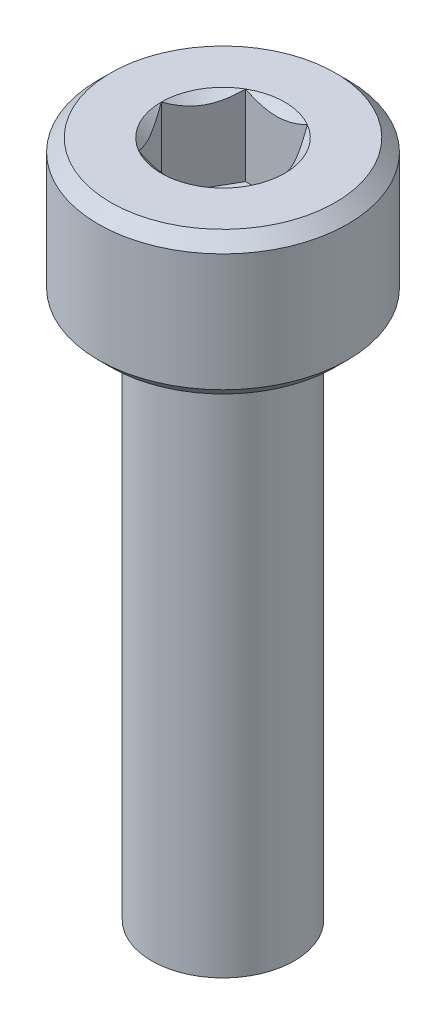
ISO-10303-21;
HEADER;
FILE_DESCRIPTION(('STEP AP214'),'2;1');
FILE_NAME('part.step','',(''),(''),'','','');
FILE_SCHEMA(('AUTOMOTIVE_DESIGN { 1 0 10303 214 1 1 1 1 }'));
ENDSEC;
DATA;
#1=APPLICATION_CONTEXT('core data for automotive mechanical design processes');
#2=APPLICATION_PROTOCOL_DEFINITION('international standard','automotive_design',2000,#1);
#3=PRODUCT_CONTEXT('',#1,'mechanical');
#4=PRODUCT('Part','Part','',(#3));
#5=PRODUCT_RELATED_PRODUCT_CATEGORY('part','',(#4));
#6=PRODUCT_DEFINITION_FORMATION('','',#4);
#7=PRODUCT_DEFINITION_CONTEXT('part definition',#1,'design');
#8=PRODUCT_DEFINITION('design','',#6,#7);
#9=PRODUCT_DEFINITION_SHAPE('','',#8);
#10=(LENGTH_UNIT() NAMED_UNIT(*) SI_UNIT(.MILLI.,.METRE.));
#11=(NAMED_UNIT(*) PLANE_ANGLE_UNIT() SI_UNIT($,.RADIAN.));
#12=(NAMED_UNIT(*) SI_UNIT($,.STERADIAN.) SOLID_ANGLE_UNIT());
#13=UNCERTAINTY_MEASURE_WITH_UNIT(LENGTH_MEASURE(1.E-05),#10,'distance_accuracy_value','');
#14=(GEOMETRIC_REPRESENTATION_CONTEXT(3) GLOBAL_UNCERTAINTY_ASSIGNED_CONTEXT((#13)) GLOBAL_UNIT_ASSIGNED_CONTEXT((#10,
#11,#12)) REPRESENTATION_CONTEXT('',''));
#15=CARTESIAN_POINT('',(0.,0.,0.));
#16=DIRECTION('',(0.,0.,1.));
#17=DIRECTION('',(1.,0.,0.));
#18=AXIS2_PLACEMENT_3D('',#15,#16,#17);
#19=CARTESIAN_POINT('',(0.,4.,0.));
#20=DIRECTION('',(0.,-1.,0.));
#21=DIRECTION('',(0.,0.,-1.));
#22=AXIS2_PLACEMENT_3D('',#19,#20,#21);
#23=CYLINDRICAL_SURFACE('',#22,3.5);
#24=CARTESIAN_POINT('',(0.,0.350000000000001,0.));
#25=DIRECTION('',(0.,1.,0.));
#26=DIRECTION('',(0.,0.,1.));
#27=AXIS2_PLACEMENT_3D('',#24,#25,#26);
#28=CIRCLE('',#27,3.5);
#29=CARTESIAN_POINT('',(0.,0.350000000000001,3.5));
#30=VERTEX_POINT('',#29);
#31=EDGE_CURVE('E229',#30,#30,#28,.T.);
#32=ORIENTED_EDGE('',*,*,#31,.T.);
#33=EDGE_LOOP('',(#32));
#34=FACE_BOUND('',#33,.T.);
#35=CARTESIAN_POINT('',(0.,3.65,0.));
#36=DIRECTION('',(0.,1.,0.));
#37=DIRECTION('',(0.,0.,1.));
#38=AXIS2_PLACEMENT_3D('',#35,#36,#37);
#39=CIRCLE('',#38,3.5);
#40=CARTESIAN_POINT('',(0.,3.65,3.5));
#41=VERTEX_POINT('',#40);
#42=EDGE_CURVE('E106',#41,#41,#39,.F.);
#43=ORIENTED_EDGE('',*,*,#42,.T.);
#44=EDGE_LOOP('',(#43));
#45=FACE_BOUND('',#44,.T.);
#46=ADVANCED_FACE('F34',(#34,#45),#23,.T.);
#47=CARTESIAN_POINT('',(0.,4.,0.));
#48=DIRECTION('',(0.,1.,0.));
#49=DIRECTION('',(0.,0.,1.));
#50=AXIS2_PLACEMENT_3D('',#47,#48,#49);
#51=PLANE('',#50);
#52=CARTESIAN_POINT('',(0.,4.,0.));
#53=DIRECTION('',(0.,1.,0.));
#54=DIRECTION('',(0.,0.,1.));
#55=AXIS2_PLACEMENT_3D('',#52,#53,#54);
#56=CIRCLE('',#55,3.15);
#57=CARTESIAN_POINT('',(0.,4.,3.15));
#58=VERTEX_POINT('',#57);
#59=EDGE_CURVE('E38',#58,#58,#56,.T.);
#60=ORIENTED_EDGE('',*,*,#59,.T.);
#61=EDGE_LOOP('',(#60));
#62=FACE_BOUND('',#61,.T.);
#63=CARTESIAN_POINT('',(0.,4.,0.));
#64=DIRECTION('',(0.,1.,0.));
#65=DIRECTION('',(0.,0.,1.));
#66=AXIS2_PLACEMENT_3D('',#63,#64,#65);
#67=CIRCLE('',#66,1.73205080756888);
#68=CARTESIAN_POINT('',(0.866025403784438,4.,1.5));
#69=VERTEX_POINT('',#68);
#70=CARTESIAN_POINT('',(1.73205080756888,4.,0.));
#71=VERTEX_POINT('',#70);
#72=EDGE_CURVE('E49',#69,#71,#67,.T.);
#73=ORIENTED_EDGE('',*,*,#72,.F.);
#74=CARTESIAN_POINT('',(-0.866025403784438,4.,1.5));
#75=VERTEX_POINT('',#74);
#76=EDGE_CURVE('E56',#75,#69,#67,.T.);
#77=ORIENTED_EDGE('',*,*,#76,.F.);
#78=CARTESIAN_POINT('',(-1.73205080756888,4.,0.));
#79=VERTEX_POINT('',#78);
#80=EDGE_CURVE('E129',#79,#75,#67,.T.);
#81=ORIENTED_EDGE('',*,*,#80,.F.);
#82=CARTESIAN_POINT('',(-0.866025403784439,4.,-1.5));
#83=VERTEX_POINT('',#82);
#84=EDGE_CURVE('E128',#83,#79,#67,.T.);
#85=ORIENTED_EDGE('',*,*,#84,.F.);
#86=CARTESIAN_POINT('',(0.866025403784438,4.,-1.5));
#87=VERTEX_POINT('',#86);
#88=EDGE_CURVE('E96',#87,#83,#67,.T.);
#89=ORIENTED_EDGE('',*,*,#88,.F.);
#90=EDGE_CURVE('E88',#71,#87,#67,.T.);
#91=ORIENTED_EDGE('',*,*,#90,.F.);
#92=EDGE_LOOP('',(#73,#77,#81,#85,#89,#91));
#93=FACE_BOUND('',#92,.T.);
#94=ADVANCED_FACE('F126',(#62,#93),#51,.T.);
#95=CARTESIAN_POINT('',(0.,0.,0.));
#96=DIRECTION('',(0.,1.,0.));
#97=DIRECTION('',(0.,0.,1.));
#98=AXIS2_PLACEMENT_3D('',#95,#96,#97);
#99=PLANE('',#98);
#100=CARTESIAN_POINT('',(0.,0.,0.));
#101=DIRECTION('',(0.,-1.,0.));
#102=DIRECTION('',(0.,0.,-1.));
#103=AXIS2_PLACEMENT_3D('',#100,#101,#102);
#104=CIRCLE('',#103,2.);
#105=CARTESIAN_POINT('',(0.,0.,-2.));
#106=VERTEX_POINT('',#105);
#107=EDGE_CURVE('E11',#106,#106,#104,.T.);
#108=ORIENTED_EDGE('',*,*,#107,.F.);
#109=EDGE_LOOP('',(#108));
#110=FACE_BOUND('',#109,.T.);
#111=CARTESIAN_POINT('',(0.,0.,0.));
#112=DIRECTION('',(0.,1.,0.));
#113=DIRECTION('',(0.,0.,1.));
#114=AXIS2_PLACEMENT_3D('',#111,#112,#113);
#115=CIRCLE('',#114,3.15);
#116=CARTESIAN_POINT('',(0.,0.,3.15));
#117=VERTEX_POINT('',#116);
#118=EDGE_CURVE('E227',#117,#117,#115,.F.);
#119=ORIENTED_EDGE('',*,*,#118,.T.);
#120=EDGE_LOOP('',(#119));
#121=FACE_BOUND('',#120,.T.);
#122=ADVANCED_FACE('F210',(#110,#121),#99,.F.);
#123=CARTESIAN_POINT('',(0.,4.,0.));
#124=DIRECTION('',(0.,1.,0.));
#125=DIRECTION('',(0.,0.,1.));
#126=AXIS2_PLACEMENT_3D('',#123,#124,#125);
#127=CONICAL_SURFACE('',#126,1.73205080756888,0.78539816339745);
#128=ORIENTED_EDGE('',*,*,#88,.T.);
#129=CARTESIAN_POINT('',(-1.72720812969692,4.55557851627079,-1.5));
#130=CARTESIAN_POINT('',(-1.68515175699268,4.52382990785743,-1.5));
#131=CARTESIAN_POINT('',(-1.64286104748673,4.49239259380738,-1.5));
#132=CARTESIAN_POINT('',(-1.55771581035942,4.43026908755641,-1.5));
#133=CARTESIAN_POINT('',(-1.51486114386668,4.3995830858922,-1.5));
#134=CARTESIAN_POINT('',(-1.3846813415127,4.30840719242716,-1.5));
#135=CARTESIAN_POINT('',(-1.29637976071654,4.24928834342677,-1.5));
#136=CARTESIAN_POINT('',(-1.11121478730467,4.1332309963165,-1.5));
#137=CARTESIAN_POINT('',(-1.01415038238167,4.07660955873301,-1.5));
#138=CARTESIAN_POINT('',(-0.815173408897606,3.97303688126565,-1.5));
#139=CARTESIAN_POINT('',(-0.713278669253285,3.92605304154167,-1.5));
#140=CARTESIAN_POINT('',(-0.560333774943112,3.86857266843083,-1.5));
#141=CARTESIAN_POINT('',(-0.511547982948042,3.85207538775725,-1.5));
#142=CARTESIAN_POINT('',(-0.412798620136866,3.822997512927,-1.5));
#143=CARTESIAN_POINT('',(-0.362834968437563,3.81041718859402,-1.5));
#144=CARTESIAN_POINT('',(-0.262863235444982,3.79003619414677,-1.5));
#145=CARTESIAN_POINT('',(-0.212872113808023,3.78215363274598,-1.5));
#146=CARTESIAN_POINT('',(-0.112355243569545,3.771322063969,-1.5));
#147=CARTESIAN_POINT('',(-0.0618295883726279,3.76837220852435,-1.5));
#148=CARTESIAN_POINT('',(0.037429173332384,3.76762485772485,-1.5));
#149=CARTESIAN_POINT('',(0.0861609672002989,3.76964473355808,-1.5));
#150=CARTESIAN_POINT('',(0.183206937768827,3.77832255289676,-1.5));
#151=CARTESIAN_POINT('',(0.231521073438269,3.78498094696846,-1.5));
#152=CARTESIAN_POINT('',(0.328199853425436,3.80268524412257,-1.5));
#153=CARTESIAN_POINT('',(0.376550616310328,3.81380581125704,-1.5));
#154=CARTESIAN_POINT('',(0.472195697125598,3.83984341404871,-1.5));
#155=CARTESIAN_POINT('',(0.51949010309274,3.85476013204094,-1.5));
#156=CARTESIAN_POINT('',(0.668391282696624,3.90733522359607,-1.5));
#157=CARTESIAN_POINT('',(0.767878709508552,3.95098128747198,-1.5));
#158=CARTESIAN_POINT('',(0.962179866690724,4.0480229945931,-1.5));
#159=CARTESIAN_POINT('',(1.05697519961444,4.10145366508953,-1.5));
#160=CARTESIAN_POINT('',(1.23814273533383,4.21168585200456,-1.5));
#161=CARTESIAN_POINT('',(1.3246994218129,4.2681879206986,-1.5));
#162=CARTESIAN_POINT('',(1.45222331290673,4.35553430157866,-1.5));
#163=CARTESIAN_POINT('',(1.49418091978756,4.38495775868004,-1.5));
#164=CARTESIAN_POINT('',(1.57752272931476,4.44458282183046,-1.5));
#165=CARTESIAN_POINT('',(1.61890708647354,4.47478421166444,-1.5));
#166=CARTESIAN_POINT('',(1.66005278019494,4.50530817860946,-1.5));
#167=B_SPLINE_CURVE_WITH_KNOTS('',3,(#129,#130,#131,#132,#133,#134,#135,#136,#137,#138,#139,
#140,#141,#142,#143,#144,#145,#146,#147,#148,#149,#150,#151,#152,#153,#154,#155,#156,#157,#158,
#159,#160,#161,#162,#163,#164,#165,#166),.UNSPECIFIED.,.F.,.F.,(4,2,2,2,2,2,2,2,2,2,2,2,2,2,2,2,
2,2,4),(0.,0.158079548982669,0.316198780993942,0.634850417346958,0.971690311361509,
1.30737131660667,1.46173961127089,1.61611853740677,1.76772101421409,1.91929742368538,
2.065387412096,2.21149159305544,2.36014984633872,2.50879566386709,2.83376031422673,
3.15991186985652,3.46985601802197,3.62358896039974,3.7772796264207),.UNSPECIFIED.);
#168=EDGE_CURVE('E101',#87,#83,#167,.F.);
#169=ORIENTED_EDGE('',*,*,#168,.F.);
#170=EDGE_LOOP('',(#128,#169));
#171=FACE_BOUND('',#170,.T.);
#172=ADVANCED_FACE('F102',(#171),#127,.F.);
#173=ORIENTED_EDGE('',*,*,#84,.T.);
#174=CARTESIAN_POINT('',(-0.865909933730601,4.00011548160007,-1.5002));
#175=CARTESIAN_POINT('',(-0.895682611594166,3.97036547606733,-1.44863220926292));
#176=CARTESIAN_POINT('',(-0.925953159489765,3.94236248391031,-1.3962020823348));
#177=CARTESIAN_POINT('',(-0.987678321317123,3.89108923044014,-1.2892909659444));
#178=CARTESIAN_POINT('',(-1.01913880822717,3.86784750504437,-1.23479980418534));
#179=CARTESIAN_POINT('',(-1.08257741237344,3.82803372899222,-1.12492091864275));
#180=CARTESIAN_POINT('',(-1.11453936608521,3.8113615856709,-1.0695611909048));
#181=CARTESIAN_POINT('',(-1.1791670593912,3.7856744568181,-0.957622742522849));
#182=CARTESIAN_POINT('',(-1.21183082354213,3.77664029047887,-0.901047443446992));
#183=CARTESIAN_POINT('',(-1.26812411040032,3.76848908122685,-0.803544610483559));
#184=CARTESIAN_POINT('',(-1.29168087824208,3.76728225298922,-0.762743091719534));
#185=CARTESIAN_POINT('',(-1.33875285845138,3.76931405716227,-0.681212030384142));
#186=CARTESIAN_POINT('',(-1.36226806050018,3.77255367074831,-0.64048250568537));
#187=CARTESIAN_POINT('',(-1.40907206156905,3.78329198598196,-0.559415597836584));
#188=CARTESIAN_POINT('',(-1.43236062923612,3.79079465301873,-0.519078615401712));
#189=CARTESIAN_POINT('',(-1.47854689118996,3.80965161192829,-0.439081663085969));
#190=CARTESIAN_POINT('',(-1.50144441326545,3.82100755701858,-0.399421991483792));
#191=CARTESIAN_POINT('',(-1.56009461325633,3.85472164759267,-0.297836865225515));
#192=CARTESIAN_POINT('',(-1.59548353987866,3.87962184909337,-0.236541446290311));
#193=CARTESIAN_POINT('',(-1.64751843074894,3.92165665327158,-0.146414371536686));
#194=CARTESIAN_POINT('',(-1.66466545167617,3.9364251535591,-0.116714860092282));
#195=CARTESIAN_POINT('',(-1.69864410935691,3.96731056594017,-0.0578620986162487));
#196=CARTESIAN_POINT('',(-1.71547589206761,3.98342683412171,-0.0287085957793624));
#197=CARTESIAN_POINT('',(-1.73216627762272,4.00011548160007,0.00020000000000028));
#198=B_SPLINE_CURVE_WITH_KNOTS('',3,(#174,#175,#176,#177,#178,#179,#180,#181,#182,#183,#184,
#185,#186,#187,#188,#189,#190,#191,#192,#193,#194,#195,#196,#197),.UNSPECIFIED.,.F.,.F.,(4,2,2,
2,2,2,2,2,2,2,2,4),(0.,0.199829143693304,0.400822987382388,0.598623720538181,0.795926240188889,
0.937113067959881,1.07833105577193,1.21968061668222,1.36109089931054,1.58570969637565,
1.69770705470964,1.80965120737194),.UNSPECIFIED.);
#199=EDGE_CURVE('E131',#83,#79,#198,.T.);
#200=ORIENTED_EDGE('',*,*,#199,.F.);
#201=EDGE_LOOP('',(#173,#200));
#202=FACE_BOUND('',#201,.T.);
#203=ADVANCED_FACE('F242',(#202),#127,.F.);
#204=ORIENTED_EDGE('',*,*,#80,.T.);
#205=CARTESIAN_POINT('',(-1.73216627762272,4.00011548160007,-0.000199999999999694));
#206=CARTESIAN_POINT('',(-1.70239359975915,3.97036547606733,0.051367790737076));
#207=CARTESIAN_POINT('',(-1.67212305186355,3.94236248391031,0.103797917665201));
#208=CARTESIAN_POINT('',(-1.61039789003619,3.89108923044014,0.210709034055597));
#209=CARTESIAN_POINT('',(-1.57893740312614,3.86784750504437,0.265200195814662));
#210=CARTESIAN_POINT('',(-1.51549879897987,3.82803372899222,0.375079081357249));
#211=CARTESIAN_POINT('',(-1.4835368452681,3.8113615856709,0.4304388090952));
#212=CARTESIAN_POINT('',(-1.41890915196211,3.7856744568181,0.542377257477151));
#213=CARTESIAN_POINT('',(-1.38624538781118,3.77664029047887,0.598952556553009));
#214=CARTESIAN_POINT('',(-1.32995210095299,3.76848908122685,0.696455389516441));
#215=CARTESIAN_POINT('',(-1.30639533311124,3.76728225298922,0.737256908280466));
#216=CARTESIAN_POINT('',(-1.25932335290193,3.76931405716227,0.818787969615858));
#217=CARTESIAN_POINT('',(-1.23580815085313,3.77255367074831,0.85951749431463));
#218=CARTESIAN_POINT('',(-1.18900414978427,3.78329198598196,0.940584402163416));
#219=CARTESIAN_POINT('',(-1.1657155821172,3.79079465301873,0.980921384598288));
#220=CARTESIAN_POINT('',(-1.11952932016335,3.80965161192829,1.06091833691403));
#221=CARTESIAN_POINT('',(-1.09663179808786,3.82100755701859,1.10057800851621));
#222=CARTESIAN_POINT('',(-1.03798159809698,3.85472164759267,1.20216313477448));
#223=CARTESIAN_POINT('',(-1.00259267147465,3.87962184909337,1.26345855370969));
#224=CARTESIAN_POINT('',(-0.950557780604375,3.92165665327158,1.35358562846331));
#225=CARTESIAN_POINT('',(-0.933410759677147,3.9364251535591,1.38328513990772));
#226=CARTESIAN_POINT('',(-0.899432101996407,3.96731056594017,1.44213790138375));
#227=CARTESIAN_POINT('',(-0.88260031928571,3.98342683412171,1.47129140422064));
#228=CARTESIAN_POINT('',(-0.865909933730601,4.00011548160007,1.5002));
#229=B_SPLINE_CURVE_WITH_KNOTS('',3,(#205,#206,#207,#208,#209,#210,#211,#212,#213,#214,#215,
#216,#217,#218,#219,#220,#221,#222,#223,#224,#225,#226,#227,#228),.UNSPECIFIED.,.F.,.F.,(4,2,2,
2,2,2,2,2,2,2,2,4),(0.,0.199829143693305,0.400822987382389,0.598623720538181,0.795926240188889,
0.937113067959881,1.07833105577193,1.21968061668222,1.36109089931054,1.58570969637565,
1.69770705470964,1.80965120737194),.UNSPECIFIED.);
#230=EDGE_CURVE('E141',#79,#75,#229,.T.);
#231=ORIENTED_EDGE('',*,*,#230,.F.);
#232=EDGE_LOOP('',(#204,#231));
#233=FACE_BOUND('',#232,.T.);
#234=ADVANCED_FACE('F258',(#233),#127,.F.);
#235=ORIENTED_EDGE('',*,*,#76,.T.);
#236=CARTESIAN_POINT('',(-1.72720812994822,4.55557851646053,1.5));
#237=CARTESIAN_POINT('',(-1.68515175723693,4.52382990803985,1.5));
#238=CARTESIAN_POINT('',(-1.64286104772391,4.49239259398251,1.5));
#239=CARTESIAN_POINT('',(-1.55771581058238,4.43026908771699,1.5));
#240=CARTESIAN_POINT('',(-1.51486114408249,4.39958308604553,1.5));
#241=CARTESIAN_POINT('',(-1.38468134170665,4.30840719255859,1.5));
#242=CARTESIAN_POINT('',(-1.29637976089561,4.24928834354366,1.5));
#243=CARTESIAN_POINT('',(-1.11121478745132,4.13323099640349,1.5));
#244=CARTESIAN_POINT('',(-1.01415038251067,4.07660955880473,1.5));
#245=CARTESIAN_POINT('',(-0.815173408989814,3.9730368813091,1.5));
#246=CARTESIAN_POINT('',(-0.71327866932636,3.92605304157206,1.5));
#247=CARTESIAN_POINT('',(-0.56033377500179,3.86857266845154,1.5));
#248=CARTESIAN_POINT('',(-0.511547983012749,3.85207538777834,1.5));
#249=CARTESIAN_POINT('',(-0.412798620213828,3.82299751294763,1.5));
#250=CARTESIAN_POINT('',(-0.362834968520751,3.8104171886138,1.5));
#251=CARTESIAN_POINT('',(-0.262863235540417,3.79003619416346,1.5));
#252=CARTESIAN_POINT('',(-0.212872113909475,3.78215363276045,1.5));
#253=CARTESIAN_POINT('',(-0.112355243682832,3.77132206397768,1.5));
#254=CARTESIAN_POINT('',(-0.061829588491731,3.76837220852945,1.5));
#255=CARTESIAN_POINT('',(0.0374291732025493,3.76762485772178,1.5));
#256=CARTESIAN_POINT('',(0.086160967065534,3.76964473355048,1.5));
#257=CARTESIAN_POINT('',(0.183206937624695,3.77832255287941,1.5));
#258=CARTESIAN_POINT('',(0.2315210732897,3.78498094694588,1.5));
#259=CARTESIAN_POINT('',(0.328199853268108,3.80268524408904,1.5));
#260=CARTESIAN_POINT('',(0.376550616148692,3.81380581121775,1.5));
#261=CARTESIAN_POINT('',(0.47219569695576,3.83984341399777,1.5));
#262=CARTESIAN_POINT('',(0.51949010291901,3.8547601319841,1.5));
#263=CARTESIAN_POINT('',(0.668391282485064,3.90733522351148,1.5));
#264=CARTESIAN_POINT('',(0.767878709264951,3.95098128736184,1.5));
#265=CARTESIAN_POINT('',(0.9621798663855,4.04802299442906,1.5));
#266=CARTESIAN_POINT('',(1.05697519927965,4.10145366489712,1.5));
#267=CARTESIAN_POINT('',(1.23814273494588,4.21168585175783,1.5));
#268=CARTESIAN_POINT('',(1.32469942140117,4.26818792042618,1.5));
#269=CARTESIAN_POINT('',(1.45222331245985,4.35553430126784,1.5));
#270=CARTESIAN_POINT('',(1.49418091932912,4.38495775835653,1.5));
#271=CARTESIAN_POINT('',(1.5775227288333,4.44458282148157,1.5));
#272=CARTESIAN_POINT('',(1.6189070859806,4.47478421130286,1.5));
#273=CARTESIAN_POINT('',(1.66005277969054,4.50530817823521,1.5));
#274=B_SPLINE_CURVE_WITH_KNOTS('',3,(#236,#237,#238,#239,#240,#241,#242,#243,#244,#245,#246,
#247,#248,#249,#250,#251,#252,#253,#254,#255,#256,#257,#258,#259,#260,#261,#262,#263,#264,#265,
#266,#267,#268,#269,#270,#271,#272,#273),.UNSPECIFIED.,.F.,.F.,(4,2,2,2,2,2,2,2,2,2,2,2,2,2,2,2,
2,2,4),(0.,0.158079549012757,0.316198781054129,0.634850417468465,0.971690311551782,
1.30737131686505,1.46173961151184,1.61611853763032,1.76772101442095,1.91929742387554,
2.06538741227089,2.21149159321503,2.36014984648185,2.50879566399376,2.83376031423511,
3.15991186974582,3.4698560178094,3.62358896013692,3.77727962610764),.UNSPECIFIED.);
#275=EDGE_CURVE('E170',#75,#69,#274,.T.);
#276=ORIENTED_EDGE('',*,*,#275,.F.);
#277=EDGE_LOOP('',(#235,#276));
#278=FACE_BOUND('',#277,.T.);
#279=ADVANCED_FACE('F288',(#278),#127,.F.);
#280=ORIENTED_EDGE('',*,*,#72,.T.);
#281=CARTESIAN_POINT('',(0.865909933730601,4.00011548160007,1.5002));
#282=CARTESIAN_POINT('',(0.895682611594166,3.97036547606733,1.44863220926292));
#283=CARTESIAN_POINT('',(0.925953159489765,3.94236248391031,1.3962020823348));
#284=CARTESIAN_POINT('',(0.987678321317124,3.89108923044014,1.2892909659444));
#285=CARTESIAN_POINT('',(1.01913880822717,3.86784750504437,1.23479980418534));
#286=CARTESIAN_POINT('',(1.08257741237344,3.82803372899222,1.12492091864275));
#287=CARTESIAN_POINT('',(1.11453936608521,3.8113615856709,1.0695611909048));
#288=CARTESIAN_POINT('',(1.1791670593912,3.7856744568181,0.95762274252285));
#289=CARTESIAN_POINT('',(1.21183082354213,3.77664029047887,0.901047443446992));
#290=CARTESIAN_POINT('',(1.26812411040032,3.76848908122685,0.80354461048356));
#291=CARTESIAN_POINT('',(1.29168087824208,3.76728225298922,0.762743091719534));
#292=CARTESIAN_POINT('',(1.33875285845138,3.76931405716227,0.681212030384142));
#293=CARTESIAN_POINT('',(1.36226806050018,3.77255367074831,0.640482505685371));
#294=CARTESIAN_POINT('',(1.40907206156905,3.78329198598196,0.559415597836584));
#295=CARTESIAN_POINT('',(1.43236062923612,3.79079465301873,0.519078615401712));
#296=CARTESIAN_POINT('',(1.47854689118996,3.80965161192829,0.43908166308597));
#297=CARTESIAN_POINT('',(1.50144441326545,3.82100755701859,0.399421991483792));
#298=CARTESIAN_POINT('',(1.56009461325633,3.85472164759267,0.297836865225515));
#299=CARTESIAN_POINT('',(1.59548353987866,3.87962184909337,0.236541446290311));
#300=CARTESIAN_POINT('',(1.64751843074894,3.92165665327158,0.146414371536686));
#301=CARTESIAN_POINT('',(1.66466545167617,3.9364251535591,0.116714860092282));
#302=CARTESIAN_POINT('',(1.69864410935691,3.96731056594017,0.0578620986162488));
#303=CARTESIAN_POINT('',(1.71547589206761,3.98342683412171,0.0287085957793626));
#304=CARTESIAN_POINT('',(1.73216627762272,4.00011548160007,-0.000200000000000026));
#305=B_SPLINE_CURVE_WITH_KNOTS('',3,(#281,#282,#283,#284,#285,#286,#287,#288,#289,#290,#291,
#292,#293,#294,#295,#296,#297,#298,#299,#300,#301,#302,#303,#304),.UNSPECIFIED.,.F.,.F.,(4,2,2,
2,2,2,2,2,2,2,2,4),(0.,0.199829143693305,0.400822987382389,0.59862372053818,0.795926240188889,
0.937113067959881,1.07833105577193,1.21968061668222,1.36109089931054,1.58570969637565,
1.69770705470964,1.80965120737194),.UNSPECIFIED.);
#306=EDGE_CURVE('E116',#69,#71,#305,.T.);
#307=ORIENTED_EDGE('',*,*,#306,.F.);
#308=EDGE_LOOP('',(#280,#307));
#309=FACE_BOUND('',#308,.T.);
#310=ADVANCED_FACE('F156',(#309),#127,.F.);
#311=ORIENTED_EDGE('',*,*,#90,.T.);
#312=CARTESIAN_POINT('',(1.73216627762272,4.00011548160007,0.000200000000000282));
#313=CARTESIAN_POINT('',(1.70239359975915,3.97036547606733,-0.0513677907370753));
#314=CARTESIAN_POINT('',(1.67212305186355,3.94236248391031,-0.103797917665201));
#315=CARTESIAN_POINT('',(1.61039789003619,3.89108923044014,-0.210709034055596));
#316=CARTESIAN_POINT('',(1.57893740312614,3.86784750504437,-0.265200195814661));
#317=CARTESIAN_POINT('',(1.51549879897987,3.82803372899222,-0.375079081357248));
#318=CARTESIAN_POINT('',(1.4835368452681,3.8113615856709,-0.430438809095199));
#319=CARTESIAN_POINT('',(1.41890915196211,3.7856744568181,-0.54237725747715));
#320=CARTESIAN_POINT('',(1.38624538781118,3.77664029047887,-0.598952556553008));
#321=CARTESIAN_POINT('',(1.32995210095299,3.76848908122685,-0.69645538951644));
#322=CARTESIAN_POINT('',(1.30639533311124,3.76728225298922,-0.737256908280466));
#323=CARTESIAN_POINT('',(1.25932335290193,3.76931405716227,-0.818787969615858));
#324=CARTESIAN_POINT('',(1.23580815085313,3.77255367074831,-0.85951749431463));
#325=CARTESIAN_POINT('',(1.18900414978427,3.78329198598196,-0.940584402163416));
#326=CARTESIAN_POINT('',(1.1657155821172,3.79079465301873,-0.980921384598288));
#327=CARTESIAN_POINT('',(1.11952932016335,3.80965161192829,-1.06091833691403));
#328=CARTESIAN_POINT('',(1.09663179808786,3.82100755701858,-1.10057800851621));
#329=CARTESIAN_POINT('',(1.03798159809698,3.85472164759267,-1.20216313477448));
#330=CARTESIAN_POINT('',(1.00259267147465,3.87962184909337,-1.26345855370969));
#331=CARTESIAN_POINT('',(0.950557780604375,3.92165665327158,-1.35358562846331));
#332=CARTESIAN_POINT('',(0.933410759677148,3.9364251535591,-1.38328513990772));
#333=CARTESIAN_POINT('',(0.899432101996407,3.96731056594017,-1.44213790138375));
#334=CARTESIAN_POINT('',(0.88260031928571,3.98342683412171,-1.47129140422064));
#335=CARTESIAN_POINT('',(0.865909933730601,4.00011548160007,-1.5002));
#336=B_SPLINE_CURVE_WITH_KNOTS('',3,(#312,#313,#314,#315,#316,#317,#318,#319,#320,#321,#322,
#323,#324,#325,#326,#327,#328,#329,#330,#331,#332,#333,#334,#335),.UNSPECIFIED.,.F.,.F.,(4,2,2,
2,2,2,2,2,2,2,2,4),(0.,0.199829143693305,0.400822987382389,0.598623720538181,0.79592624018889,
0.937113067959881,1.07833105577193,1.21968061668222,1.36109089931054,1.58570969637566,
1.69770705470964,1.80965120737194),.UNSPECIFIED.);
#337=EDGE_CURVE('E92',#71,#87,#336,.T.);
#338=ORIENTED_EDGE('',*,*,#337,.F.);
#339=EDGE_LOOP('',(#311,#338));
#340=FACE_BOUND('',#339,.T.);
#341=ADVANCED_FACE('F90',(#340),#127,.F.);
#342=CARTESIAN_POINT('',(0.,1.75,0.));
#343=DIRECTION('',(0.,1.,0.));
#344=DIRECTION('',(0.,0.,1.));
#345=AXIS2_PLACEMENT_3D('',#342,#343,#344);
#346=PLANE('',#345);
#347=DIRECTION('',(-0.5,0.,-0.866025403784439));
#348=VECTOR('',#347,1.);
#349=CARTESIAN_POINT('',(1.73205080756888,1.75,0.));
#350=LINE('',#349,#348);
#351=CARTESIAN_POINT('',(1.73205080756888,1.75,0.));
#352=VERTEX_POINT('',#351);
#353=CARTESIAN_POINT('',(0.866025403784438,1.75,-1.5));
#354=VERTEX_POINT('',#353);
#355=EDGE_CURVE('E115',#352,#354,#350,.T.);
#356=ORIENTED_EDGE('',*,*,#355,.T.);
#357=DIRECTION('',(-1.,0.,0.));
#358=VECTOR('',#357,1.);
#359=CARTESIAN_POINT('',(0.866025403784438,1.75,-1.5));
#360=LINE('',#359,#358);
#361=CARTESIAN_POINT('',(-0.866025403784439,1.75,-1.5));
#362=VERTEX_POINT('',#361);
#363=EDGE_CURVE('E120',#354,#362,#360,.T.);
#364=ORIENTED_EDGE('',*,*,#363,.T.);
#365=DIRECTION('',(-0.5,0.,0.866025403784439));
#366=VECTOR('',#365,1.);
#367=CARTESIAN_POINT('',(-0.866025403784439,1.75,-1.5));
#368=LINE('',#367,#366);
#369=CARTESIAN_POINT('',(-1.73205080756888,1.75,0.));
#370=VERTEX_POINT('',#369);
#371=EDGE_CURVE('E282',#362,#370,#368,.T.);
#372=ORIENTED_EDGE('',*,*,#371,.T.);
#373=DIRECTION('',(0.5,0.,0.866025403784439));
#374=VECTOR('',#373,1.);
#375=CARTESIAN_POINT('',(-1.73205080756888,1.75,0.));
#376=LINE('',#375,#374);
#377=CARTESIAN_POINT('',(-0.866025403784438,1.75,1.5));
#378=VERTEX_POINT('',#377);
#379=EDGE_CURVE('E265',#370,#378,#376,.T.);
#380=ORIENTED_EDGE('',*,*,#379,.T.);
#381=DIRECTION('',(1.,0.,0.));
#382=VECTOR('',#381,1.);
#383=CARTESIAN_POINT('',(-0.866025403784438,1.75,1.5));
#384=LINE('',#383,#382);
#385=CARTESIAN_POINT('',(0.866025403784439,1.75,1.5));
#386=VERTEX_POINT('',#385);
#387=EDGE_CURVE('E278',#378,#386,#384,.T.);
#388=ORIENTED_EDGE('',*,*,#387,.T.);
#389=DIRECTION('',(0.5,0.,-0.866025403784439));
#390=VECTOR('',#389,1.);
#391=CARTESIAN_POINT('',(0.866025403784439,1.75,1.5));
#392=LINE('',#391,#390);
#393=EDGE_CURVE('E123',#386,#352,#392,.T.);
#394=ORIENTED_EDGE('',*,*,#393,.T.);
#395=EDGE_LOOP('',(#356,#364,#372,#380,#388,#394));
#396=FACE_BOUND('',#395,.T.);
#397=ADVANCED_FACE('F155',(#396),#346,.T.);
#398=CARTESIAN_POINT('',(0.866025403784438,1.75,-1.5));
#399=DIRECTION('',(0.,0.,-1.));
#400=DIRECTION('',(-1.,0.,0.));
#401=AXIS2_PLACEMENT_3D('',#398,#399,#400);
#402=PLANE('',#401);
#403=DIRECTION('',(0.,1.,0.));
#404=VECTOR('',#403,1.);
#405=CARTESIAN_POINT('',(0.866025403784438,1.75,-1.5));
#406=LINE('',#405,#404);
#407=EDGE_CURVE('E113',#354,#87,#406,.T.);
#408=ORIENTED_EDGE('',*,*,#407,.T.);
#409=ORIENTED_EDGE('',*,*,#168,.T.);
#410=DIRECTION('',(0.,1.,0.));
#411=VECTOR('',#410,1.);
#412=CARTESIAN_POINT('',(-0.866025403784439,1.75,-1.5));
#413=LINE('',#412,#411);
#414=EDGE_CURVE('E122',#362,#83,#413,.T.);
#415=ORIENTED_EDGE('',*,*,#414,.F.);
#416=ORIENTED_EDGE('',*,*,#363,.F.);
#417=EDGE_LOOP('',(#408,#409,#415,#416));
#418=FACE_BOUND('',#417,.T.);
#419=ADVANCED_FACE('F118',(#418),#402,.F.);
#420=CARTESIAN_POINT('',(-0.866025403784439,1.75,-1.5));
#421=DIRECTION('',(-0.866025403784439,0.,-0.5));
#422=DIRECTION('',(-0.5,0.,0.866025403784439));
#423=AXIS2_PLACEMENT_3D('',#420,#421,#422);
#424=PLANE('',#423);
#425=ORIENTED_EDGE('',*,*,#414,.T.);
#426=ORIENTED_EDGE('',*,*,#199,.T.);
#427=DIRECTION('',(0.,1.,0.));
#428=VECTOR('',#427,1.);
#429=CARTESIAN_POINT('',(-1.73205080756888,1.75,0.));
#430=LINE('',#429,#428);
#431=EDGE_CURVE('E261',#370,#79,#430,.T.);
#432=ORIENTED_EDGE('',*,*,#431,.F.);
#433=ORIENTED_EDGE('',*,*,#371,.F.);
#434=EDGE_LOOP('',(#425,#426,#432,#433));
#435=FACE_BOUND('',#434,.T.);
#436=ADVANCED_FACE('F148',(#435),#424,.F.);
#437=CARTESIAN_POINT('',(-1.73205080756888,1.75,0.));
#438=DIRECTION('',(-0.866025403784439,0.,0.5));
#439=DIRECTION('',(0.5,0.,0.866025403784439));
#440=AXIS2_PLACEMENT_3D('',#437,#438,#439);
#441=PLANE('',#440);
#442=ORIENTED_EDGE('',*,*,#431,.T.);
#443=ORIENTED_EDGE('',*,*,#230,.T.);
#444=DIRECTION('',(0.,1.,0.));
#445=VECTOR('',#444,1.);
#446=CARTESIAN_POINT('',(-0.866025403784438,1.75,1.5));
#447=LINE('',#446,#445);
#448=EDGE_CURVE('E267',#378,#75,#447,.T.);
#449=ORIENTED_EDGE('',*,*,#448,.F.);
#450=ORIENTED_EDGE('',*,*,#379,.F.);
#451=EDGE_LOOP('',(#442,#443,#449,#450));
#452=FACE_BOUND('',#451,.T.);
#453=ADVANCED_FACE('F194',(#452),#441,.F.);
#454=CARTESIAN_POINT('',(-0.866025403784438,1.75,1.5));
#455=DIRECTION('',(0.,0.,1.));
#456=DIRECTION('',(1.,0.,0.));
#457=AXIS2_PLACEMENT_3D('',#454,#455,#456);
#458=PLANE('',#457);
#459=ORIENTED_EDGE('',*,*,#448,.T.);
#460=ORIENTED_EDGE('',*,*,#275,.T.);
#461=DIRECTION('',(0.,1.,0.));
#462=VECTOR('',#461,1.);
#463=CARTESIAN_POINT('',(0.866025403784439,1.75,1.5));
#464=LINE('',#463,#462);
#465=EDGE_CURVE('E269',#386,#69,#464,.T.);
#466=ORIENTED_EDGE('',*,*,#465,.F.);
#467=ORIENTED_EDGE('',*,*,#387,.F.);
#468=EDGE_LOOP('',(#459,#460,#466,#467));
#469=FACE_BOUND('',#468,.T.);
#470=ADVANCED_FACE('F190',(#469),#458,.F.);
#471=CARTESIAN_POINT('',(0.866025403784439,1.75,1.5));
#472=DIRECTION('',(0.866025403784439,0.,0.5));
#473=DIRECTION('',(0.5,0.,-0.866025403784439));
#474=AXIS2_PLACEMENT_3D('',#471,#472,#473);
#475=PLANE('',#474);
#476=ORIENTED_EDGE('',*,*,#465,.T.);
#477=ORIENTED_EDGE('',*,*,#306,.T.);
#478=DIRECTION('',(0.,1.,0.));
#479=VECTOR('',#478,1.);
#480=CARTESIAN_POINT('',(1.73205080756888,1.75,0.));
#481=LINE('',#480,#479);
#482=EDGE_CURVE('E107',#352,#71,#481,.T.);
#483=ORIENTED_EDGE('',*,*,#482,.F.);
#484=ORIENTED_EDGE('',*,*,#393,.F.);
#485=EDGE_LOOP('',(#476,#477,#483,#484));
#486=FACE_BOUND('',#485,.T.);
#487=ADVANCED_FACE('F187',(#486),#475,.F.);
#488=CARTESIAN_POINT('',(1.73205080756888,1.75,0.));
#489=DIRECTION('',(0.866025403784439,0.,-0.5));
#490=DIRECTION('',(-0.5,0.,-0.866025403784439));
#491=AXIS2_PLACEMENT_3D('',#488,#489,#490);
#492=PLANE('',#491);
#493=ORIENTED_EDGE('',*,*,#482,.T.);
#494=ORIENTED_EDGE('',*,*,#337,.T.);
#495=ORIENTED_EDGE('',*,*,#407,.F.);
#496=ORIENTED_EDGE('',*,*,#355,.F.);
#497=EDGE_LOOP('',(#493,#494,#495,#496));
#498=FACE_BOUND('',#497,.T.);
#499=ADVANCED_FACE('F111',(#498),#492,.F.);
#500=CARTESIAN_POINT('',(0.,0.350000000000001,0.));
#501=DIRECTION('',(0.,1.,0.));
#502=DIRECTION('',(0.,0.,1.));
#503=AXIS2_PLACEMENT_3D('',#500,#501,#502);
#504=CONICAL_SURFACE('',#503,3.5,0.78539816339745);
#505=ORIENTED_EDGE('',*,*,#118,.F.);
#506=EDGE_LOOP('',(#505));
#507=FACE_BOUND('',#506,.T.);
#508=ORIENTED_EDGE('',*,*,#31,.F.);
#509=EDGE_LOOP('',(#508));
#510=FACE_BOUND('',#509,.T.);
#511=ADVANCED_FACE('F216',(#507,#510),#504,.T.);
#512=CARTESIAN_POINT('',(0.,4.,0.));
#513=DIRECTION('',(0.,-1.,0.));
#514=DIRECTION('',(0.,0.,-1.));
#515=AXIS2_PLACEMENT_3D('',#512,#513,#514);
#516=CONICAL_SURFACE('',#515,3.15,0.785398163397448);
#517=ORIENTED_EDGE('',*,*,#42,.F.);
#518=EDGE_LOOP('',(#517));
#519=FACE_BOUND('',#518,.T.);
#520=ORIENTED_EDGE('',*,*,#59,.F.);
#521=EDGE_LOOP('',(#520));
#522=FACE_BOUND('',#521,.T.);
#523=ADVANCED_FACE('F36',(#519,#522),#516,.T.);
#524=CARTESIAN_POINT('',(0.,-15.,0.));
#525=DIRECTION('',(0.,1.,0.));
#526=DIRECTION('',(0.,0.,1.));
#527=AXIS2_PLACEMENT_3D('',#524,#525,#526);
#528=CYLINDRICAL_SURFACE('',#527,2.);
#529=CARTESIAN_POINT('',(0.,-15.,0.));
#530=DIRECTION('',(0.,-1.,0.));
#531=DIRECTION('',(0.,0.,-1.));
#532=AXIS2_PLACEMENT_3D('',#529,#530,#531);
#533=CIRCLE('',#532,2.);
#534=CARTESIAN_POINT('',(0.,-15.,-2.));
#535=VERTEX_POINT('',#534);
#536=EDGE_CURVE('E254',#535,#535,#533,.T.);
#537=ORIENTED_EDGE('',*,*,#536,.F.);
#538=EDGE_LOOP('',(#537));
#539=FACE_BOUND('',#538,.T.);
#540=ORIENTED_EDGE('',*,*,#107,.T.);
#541=EDGE_LOOP('',(#540));
#542=FACE_BOUND('',#541,.T.);
#543=ADVANCED_FACE('F157',(#539,#542),#528,.T.);
#544=CARTESIAN_POINT('',(0.,-15.,0.));
#545=DIRECTION('',(0.,-1.,0.));
#546=DIRECTION('',(0.,0.,-1.));
#547=AXIS2_PLACEMENT_3D('',#544,#545,#546);
#548=PLANE('',#547);
#549=ORIENTED_EDGE('',*,*,#536,.T.);
#550=EDGE_LOOP('',(#549));
#551=FACE_BOUND('',#550,.T.);
#552=ADVANCED_FACE('F246',(#551),#548,.T.);
#553=CLOSED_SHELL('',(#46,#94,#122,#172,#203,#234,#279,#310,#341,#397,#419,#436,#453,#470,#487,
#499,#511,#523,#543,#552));
#554=MANIFOLD_SOLID_BREP('B2',#553);
#555=ADVANCED_BREP_SHAPE_REPRESENTATION('',(#18,#554),#14);
#556=SHAPE_DEFINITION_REPRESENTATION(#9,#555);
ENDSEC;
END-ISO-10303-21;
